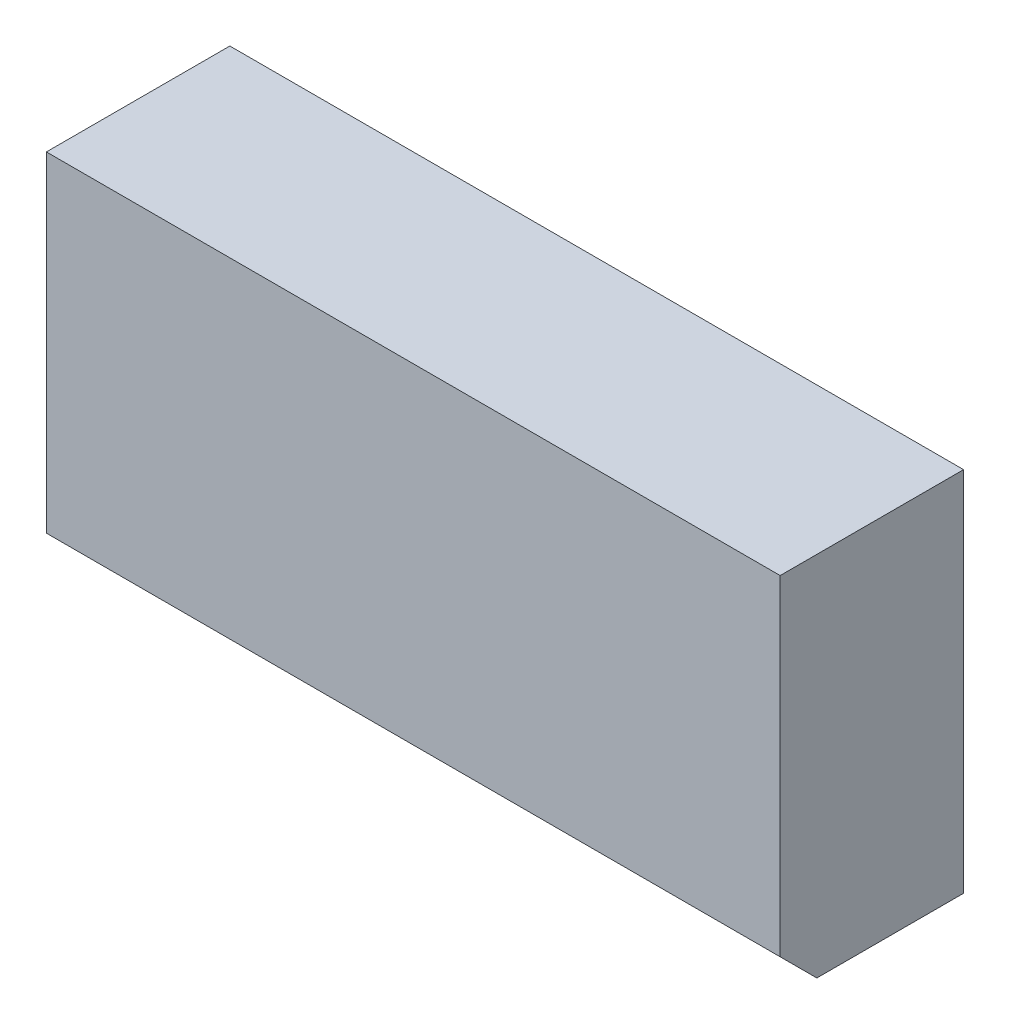
ISO-10303-21;
HEADER;
FILE_DESCRIPTION(('STEP AP214'),'2;1');
FILE_NAME('part.step','',(''),(''),'','','');
FILE_SCHEMA(('AUTOMOTIVE_DESIGN { 1 0 10303 214 1 1 1 1 }'));
ENDSEC;
DATA;
#1=APPLICATION_CONTEXT('core data for automotive mechanical design processes');
#2=APPLICATION_PROTOCOL_DEFINITION('international standard','automotive_design',2000,#1);
#3=PRODUCT_CONTEXT('',#1,'mechanical');
#4=PRODUCT('Part','Part','',(#3));
#5=PRODUCT_RELATED_PRODUCT_CATEGORY('part','',(#4));
#6=PRODUCT_DEFINITION_FORMATION('','',#4);
#7=PRODUCT_DEFINITION_CONTEXT('part definition',#1,'design');
#8=PRODUCT_DEFINITION('design','',#6,#7);
#9=PRODUCT_DEFINITION_SHAPE('','',#8);
#10=(LENGTH_UNIT() NAMED_UNIT(*) SI_UNIT(.MILLI.,.METRE.));
#11=(NAMED_UNIT(*) PLANE_ANGLE_UNIT() SI_UNIT($,.RADIAN.));
#12=(NAMED_UNIT(*) SI_UNIT($,.STERADIAN.) SOLID_ANGLE_UNIT());
#13=UNCERTAINTY_MEASURE_WITH_UNIT(LENGTH_MEASURE(1.E-05),#10,'distance_accuracy_value','');
#14=(GEOMETRIC_REPRESENTATION_CONTEXT(3) GLOBAL_UNCERTAINTY_ASSIGNED_CONTEXT((#13)) GLOBAL_UNIT_ASSIGNED_CONTEXT((#10,
#11,#12)) REPRESENTATION_CONTEXT('',''));
#15=CARTESIAN_POINT('',(0.,0.,0.));
#16=DIRECTION('',(0.,0.,1.));
#17=DIRECTION('',(1.,0.,0.));
#18=AXIS2_PLACEMENT_3D('',#15,#16,#17);
#19=CARTESIAN_POINT('',(0.,20.,10.));
#20=DIRECTION('',(1.,0.,0.));
#21=DIRECTION('',(0.,0.,-1.));
#22=AXIS2_PLACEMENT_3D('',#19,#20,#21);
#23=PLANE('',#22);
#24=DIRECTION('',(0.,0.,-1.));
#25=VECTOR('',#24,1.);
#26=CARTESIAN_POINT('',(0.,0.,10.));
#27=LINE('',#26,#25);
#28=CARTESIAN_POINT('',(0.,0.,7.99999999999999));
#29=VERTEX_POINT('',#28);
#30=CARTESIAN_POINT('',(0.,0.,0.));
#31=VERTEX_POINT('',#30);
#32=EDGE_CURVE('E126',#29,#31,#27,.T.);
#33=ORIENTED_EDGE('',*,*,#32,.F.);
#34=DIRECTION('',(0.,0.707106781186548,0.707106781186548));
#35=VECTOR('',#34,1.);
#36=CARTESIAN_POINT('',(0.,2.00000000000001,10.));
#37=LINE('',#36,#35);
#38=CARTESIAN_POINT('',(0.,2.00000000000001,10.));
#39=VERTEX_POINT('',#38);
#40=EDGE_CURVE('E11',#29,#39,#37,.T.);
#41=ORIENTED_EDGE('',*,*,#40,.T.);
#42=DIRECTION('',(0.,-1.,0.));
#43=VECTOR('',#42,1.);
#44=CARTESIAN_POINT('',(0.,20.,10.));
#45=LINE('',#44,#43);
#46=CARTESIAN_POINT('',(0.,20.,10.));
#47=VERTEX_POINT('',#46);
#48=EDGE_CURVE('E97',#47,#39,#45,.T.);
#49=ORIENTED_EDGE('',*,*,#48,.F.);
#50=DIRECTION('',(0.,0.,-1.));
#51=VECTOR('',#50,1.);
#52=CARTESIAN_POINT('',(0.,20.,10.));
#53=LINE('',#52,#51);
#54=CARTESIAN_POINT('',(0.,20.,0.));
#55=VERTEX_POINT('',#54);
#56=EDGE_CURVE('E107',#47,#55,#53,.T.);
#57=ORIENTED_EDGE('',*,*,#56,.T.);
#58=DIRECTION('',(0.,-1.,0.));
#59=VECTOR('',#58,1.);
#60=CARTESIAN_POINT('',(0.,20.,0.));
#61=LINE('',#60,#59);
#62=EDGE_CURVE('E116',#55,#31,#61,.T.);
#63=ORIENTED_EDGE('',*,*,#62,.T.);
#64=EDGE_LOOP('',(#33,#41,#49,#57,#63));
#65=FACE_BOUND('',#64,.T.);
#66=ADVANCED_FACE('F43',(#65),#23,.F.);
#67=CARTESIAN_POINT('',(0.,0.,10.));
#68=DIRECTION('',(0.,1.,0.));
#69=DIRECTION('',(0.,0.,1.));
#70=AXIS2_PLACEMENT_3D('',#67,#68,#69);
#71=PLANE('',#70);
#72=DIRECTION('',(0.,0.,-1.));
#73=VECTOR('',#72,1.);
#74=CARTESIAN_POINT('',(40.,0.,10.));
#75=LINE('',#74,#73);
#76=CARTESIAN_POINT('',(40.,0.,7.99999999999999));
#77=VERTEX_POINT('',#76);
#78=CARTESIAN_POINT('',(40.,0.,0.));
#79=VERTEX_POINT('',#78);
#80=EDGE_CURVE('E106',#77,#79,#75,.T.);
#81=ORIENTED_EDGE('',*,*,#80,.F.);
#82=DIRECTION('',(-1.,0.,0.));
#83=VECTOR('',#82,1.);
#84=CARTESIAN_POINT('',(0.,0.,7.99999999999999));
#85=LINE('',#84,#83);
#86=EDGE_CURVE('E52',#77,#29,#85,.T.);
#87=ORIENTED_EDGE('',*,*,#86,.T.);
#88=ORIENTED_EDGE('',*,*,#32,.T.);
#89=DIRECTION('',(1.,0.,0.));
#90=VECTOR('',#89,1.);
#91=CARTESIAN_POINT('',(0.,0.,0.));
#92=LINE('',#91,#90);
#93=EDGE_CURVE('E119',#31,#79,#92,.T.);
#94=ORIENTED_EDGE('',*,*,#93,.T.);
#95=EDGE_LOOP('',(#81,#87,#88,#94));
#96=FACE_BOUND('',#95,.T.);
#97=ADVANCED_FACE('F130',(#96),#71,.F.);
#98=CARTESIAN_POINT('',(40.,0.,10.));
#99=DIRECTION('',(-1.,0.,0.));
#100=DIRECTION('',(0.,0.,1.));
#101=AXIS2_PLACEMENT_3D('',#98,#99,#100);
#102=PLANE('',#101);
#103=DIRECTION('',(0.,1.,0.));
#104=VECTOR('',#103,1.);
#105=CARTESIAN_POINT('',(40.,0.,10.));
#106=LINE('',#105,#104);
#107=CARTESIAN_POINT('',(40.,2.00000000000001,10.));
#108=VERTEX_POINT('',#107);
#109=CARTESIAN_POINT('',(40.,20.,10.));
#110=VERTEX_POINT('',#109);
#111=EDGE_CURVE('E88',#108,#110,#106,.T.);
#112=ORIENTED_EDGE('',*,*,#111,.F.);
#113=DIRECTION('',(0.,-0.707106781186548,-0.707106781186548));
#114=VECTOR('',#113,1.);
#115=CARTESIAN_POINT('',(40.,2.00000000000001,10.));
#116=LINE('',#115,#114);
#117=EDGE_CURVE('E66',#108,#77,#116,.T.);
#118=ORIENTED_EDGE('',*,*,#117,.T.);
#119=ORIENTED_EDGE('',*,*,#80,.T.);
#120=DIRECTION('',(0.,1.,0.));
#121=VECTOR('',#120,1.);
#122=CARTESIAN_POINT('',(40.,0.,0.));
#123=LINE('',#122,#121);
#124=CARTESIAN_POINT('',(40.,20.,0.));
#125=VERTEX_POINT('',#124);
#126=EDGE_CURVE('E103',#79,#125,#123,.T.);
#127=ORIENTED_EDGE('',*,*,#126,.T.);
#128=DIRECTION('',(0.,0.,-1.));
#129=VECTOR('',#128,1.);
#130=CARTESIAN_POINT('',(40.,20.,10.));
#131=LINE('',#130,#129);
#132=EDGE_CURVE('E100',#110,#125,#131,.T.);
#133=ORIENTED_EDGE('',*,*,#132,.F.);
#134=EDGE_LOOP('',(#112,#118,#119,#127,#133));
#135=FACE_BOUND('',#134,.T.);
#136=ADVANCED_FACE('F101',(#135),#102,.F.);
#137=CARTESIAN_POINT('',(40.,20.,10.));
#138=DIRECTION('',(0.,-1.,0.));
#139=DIRECTION('',(0.,0.,-1.));
#140=AXIS2_PLACEMENT_3D('',#137,#138,#139);
#141=PLANE('',#140);
#142=DIRECTION('',(-1.,0.,0.));
#143=VECTOR('',#142,1.);
#144=CARTESIAN_POINT('',(40.,20.,0.));
#145=LINE('',#144,#143);
#146=EDGE_CURVE('E123',#125,#55,#145,.T.);
#147=ORIENTED_EDGE('',*,*,#146,.T.);
#148=ORIENTED_EDGE('',*,*,#56,.F.);
#149=DIRECTION('',(-1.,0.,0.));
#150=VECTOR('',#149,1.);
#151=CARTESIAN_POINT('',(40.,20.,10.));
#152=LINE('',#151,#150);
#153=EDGE_CURVE('E93',#110,#47,#152,.T.);
#154=ORIENTED_EDGE('',*,*,#153,.F.);
#155=ORIENTED_EDGE('',*,*,#132,.T.);
#156=EDGE_LOOP('',(#147,#148,#154,#155));
#157=FACE_BOUND('',#156,.T.);
#158=ADVANCED_FACE('F109',(#157),#141,.F.);
#159=CARTESIAN_POINT('',(0.,0.,10.));
#160=DIRECTION('',(0.,0.,1.));
#161=DIRECTION('',(1.,0.,0.));
#162=AXIS2_PLACEMENT_3D('',#159,#160,#161);
#163=PLANE('',#162);
#164=ORIENTED_EDGE('',*,*,#48,.T.);
#165=DIRECTION('',(1.,0.,0.));
#166=VECTOR('',#165,1.);
#167=CARTESIAN_POINT('',(40.,2.00000000000001,10.));
#168=LINE('',#167,#166);
#169=EDGE_CURVE('E96',#39,#108,#168,.T.);
#170=ORIENTED_EDGE('',*,*,#169,.T.);
#171=ORIENTED_EDGE('',*,*,#111,.T.);
#172=ORIENTED_EDGE('',*,*,#153,.T.);
#173=EDGE_LOOP('',(#164,#170,#171,#172));
#174=FACE_BOUND('',#173,.T.);
#175=ADVANCED_FACE('F91',(#174),#163,.T.);
#176=CARTESIAN_POINT('',(0.,0.,0.));
#177=DIRECTION('',(0.,0.,1.));
#178=DIRECTION('',(1.,0.,0.));
#179=AXIS2_PLACEMENT_3D('',#176,#177,#178);
#180=PLANE('',#179);
#181=ORIENTED_EDGE('',*,*,#62,.F.);
#182=ORIENTED_EDGE('',*,*,#146,.F.);
#183=ORIENTED_EDGE('',*,*,#126,.F.);
#184=ORIENTED_EDGE('',*,*,#93,.F.);
#185=EDGE_LOOP('',(#181,#182,#183,#184));
#186=FACE_BOUND('',#185,.T.);
#187=ADVANCED_FACE('F135',(#186),#180,.F.);
#188=CARTESIAN_POINT('',(0.,2.00000000000001,10.));
#189=DIRECTION('',(0.,-0.707106781186548,0.707106781186548));
#190=DIRECTION('',(-1.,0.,0.));
#191=AXIS2_PLACEMENT_3D('',#188,#189,#190);
#192=PLANE('',#191);
#193=ORIENTED_EDGE('',*,*,#40,.F.);
#194=ORIENTED_EDGE('',*,*,#86,.F.);
#195=ORIENTED_EDGE('',*,*,#117,.F.);
#196=ORIENTED_EDGE('',*,*,#169,.F.);
#197=EDGE_LOOP('',(#193,#194,#195,#196));
#198=FACE_BOUND('',#197,.T.);
#199=ADVANCED_FACE('F46',(#198),#192,.T.);
#200=CLOSED_SHELL('',(#66,#97,#136,#158,#175,#187,#199));
#201=MANIFOLD_SOLID_BREP('B2',#200);
#202=ADVANCED_BREP_SHAPE_REPRESENTATION('',(#18,#201),#14);
#203=SHAPE_DEFINITION_REPRESENTATION(#9,#202);
ENDSEC;
END-ISO-10303-21;
